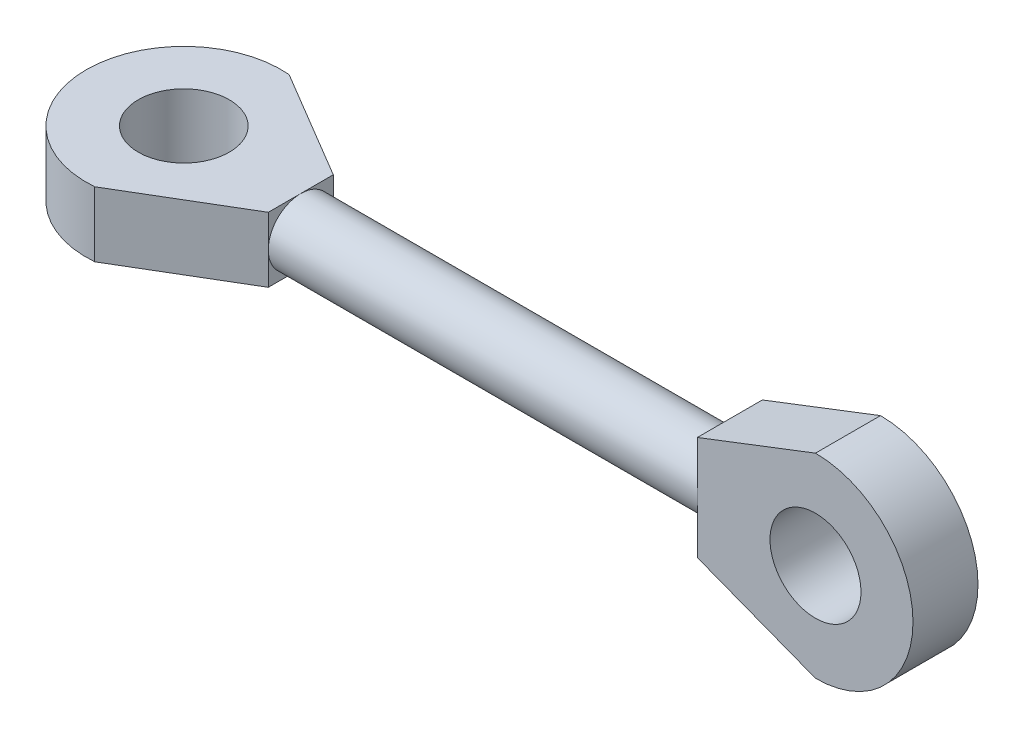
ISO-10303-21;
HEADER;
FILE_DESCRIPTION(('STEP AP214'),'2;1');
FILE_NAME('part.step','',(''),(''),'','','');
FILE_SCHEMA(('AUTOMOTIVE_DESIGN { 1 0 10303 214 1 1 1 1 }'));
ENDSEC;
DATA;
#1=APPLICATION_CONTEXT('core data for automotive mechanical design processes');
#2=APPLICATION_PROTOCOL_DEFINITION('international standard','automotive_design',2000,#1);
#3=PRODUCT_CONTEXT('',#1,'mechanical');
#4=PRODUCT('Part','Part','',(#3));
#5=PRODUCT_RELATED_PRODUCT_CATEGORY('part','',(#4));
#6=PRODUCT_DEFINITION_FORMATION('','',#4);
#7=PRODUCT_DEFINITION_CONTEXT('part definition',#1,'design');
#8=PRODUCT_DEFINITION('design','',#6,#7);
#9=PRODUCT_DEFINITION_SHAPE('','',#8);
#10=(LENGTH_UNIT() NAMED_UNIT(*) SI_UNIT(.MILLI.,.METRE.));
#11=(NAMED_UNIT(*) PLANE_ANGLE_UNIT() SI_UNIT($,.RADIAN.));
#12=(NAMED_UNIT(*) SI_UNIT($,.STERADIAN.) SOLID_ANGLE_UNIT());
#13=UNCERTAINTY_MEASURE_WITH_UNIT(LENGTH_MEASURE(1.E-05),#10,'distance_accuracy_value','');
#14=(GEOMETRIC_REPRESENTATION_CONTEXT(3) GLOBAL_UNCERTAINTY_ASSIGNED_CONTEXT((#13)) GLOBAL_UNIT_ASSIGNED_CONTEXT((#10,
#11,#12)) REPRESENTATION_CONTEXT('',''));
#15=CARTESIAN_POINT('',(0.,0.,0.));
#16=DIRECTION('',(0.,0.,1.));
#17=DIRECTION('',(1.,0.,0.));
#18=AXIS2_PLACEMENT_3D('',#15,#16,#17);
#19=CARTESIAN_POINT('',(-9.08842369138796,0.,2.5));
#20=DIRECTION('',(1.,0.,0.));
#21=DIRECTION('',(0.,0.,-1.));
#22=AXIS2_PLACEMENT_3D('',#19,#20,#21);
#23=PLANE('',#22);
#24=CARTESIAN_POINT('',(-9.08842369138796,0.,0.));
#25=DIRECTION('',(-1.,0.,0.));
#26=DIRECTION('',(0.,0.,1.));
#27=AXIS2_PLACEMENT_3D('',#24,#25,#26);
#28=CIRCLE('',#27,2.5);
#29=CARTESIAN_POINT('',(-9.08842369138796,0.,2.5));
#30=VERTEX_POINT('',#29);
#31=CARTESIAN_POINT('',(-9.08842369138796,0.,-2.5));
#32=VERTEX_POINT('',#31);
#33=EDGE_CURVE('E52',#30,#32,#28,.T.);
#34=ORIENTED_EDGE('',*,*,#33,.F.);
#35=DIRECTION('',(0.,-1.,0.));
#36=VECTOR('',#35,1.);
#37=CARTESIAN_POINT('',(-9.08842369138796,0.,2.5));
#38=LINE('',#37,#36);
#39=CARTESIAN_POINT('',(-9.08842369138796,4.,2.5));
#40=VERTEX_POINT('',#39);
#41=EDGE_CURVE('E187',#40,#30,#38,.T.);
#42=ORIENTED_EDGE('',*,*,#41,.F.);
#43=DIRECTION('',(0.,0.,-1.));
#44=VECTOR('',#43,1.);
#45=CARTESIAN_POINT('',(-9.08842369138796,4.,2.5));
#46=LINE('',#45,#44);
#47=CARTESIAN_POINT('',(-9.08842369138796,4.,-2.5));
#48=VERTEX_POINT('',#47);
#49=EDGE_CURVE('E213',#40,#48,#46,.T.);
#50=ORIENTED_EDGE('',*,*,#49,.T.);
#51=DIRECTION('',(0.,-1.,0.));
#52=VECTOR('',#51,1.);
#53=CARTESIAN_POINT('',(-9.08842369138796,0.,-2.5));
#54=LINE('',#53,#52);
#55=EDGE_CURVE('E174',#48,#32,#54,.T.);
#56=ORIENTED_EDGE('',*,*,#55,.T.);
#57=EDGE_LOOP('',(#34,#42,#50,#56));
#58=FACE_BOUND('',#57,.T.);
#59=ADVANCED_FACE('F41',(#58),#23,.F.);
#60=CARTESIAN_POINT('',(-2.51526112156498,-6.53135964778805,2.5));
#61=DIRECTION('',(-0.359377304460914,-0.933192345145634,0.));
#62=DIRECTION('',(0.933192345145634,-0.359377304460914,0.));
#63=AXIS2_PLACEMENT_3D('',#60,#61,#62);
#64=PLANE('',#63);
#65=DIRECTION('',(-0.933192345145634,0.359377304460914,0.));
#66=VECTOR('',#65,1.);
#67=CARTESIAN_POINT('',(-2.51526112156498,-6.53135964778805,-2.5));
#68=LINE('',#67,#66);
#69=CARTESIAN_POINT('',(0.,-7.5,-2.5));
#70=VERTEX_POINT('',#69);
#71=CARTESIAN_POINT('',(-9.08842369138796,-4.,-2.5));
#72=VERTEX_POINT('',#71);
#73=EDGE_CURVE('E194',#70,#72,#68,.T.);
#74=ORIENTED_EDGE('',*,*,#73,.F.);
#75=DIRECTION('',(0.,0.,-1.));
#76=VECTOR('',#75,1.);
#77=CARTESIAN_POINT('',(0.,-7.5,2.5));
#78=LINE('',#77,#76);
#79=CARTESIAN_POINT('',(0.,-7.5,2.5));
#80=VERTEX_POINT('',#79);
#81=EDGE_CURVE('E45',#80,#70,#78,.T.);
#82=ORIENTED_EDGE('',*,*,#81,.F.);
#83=DIRECTION('',(-0.933192345145634,0.359377304460914,0.));
#84=VECTOR('',#83,1.);
#85=CARTESIAN_POINT('',(-2.51526112156498,-6.53135964778805,2.5));
#86=LINE('',#85,#84);
#87=CARTESIAN_POINT('',(-9.08842369138796,-4.,2.5));
#88=VERTEX_POINT('',#87);
#89=EDGE_CURVE('E173',#80,#88,#86,.T.);
#90=ORIENTED_EDGE('',*,*,#89,.T.);
#91=DIRECTION('',(0.,0.,-1.));
#92=VECTOR('',#91,1.);
#93=CARTESIAN_POINT('',(-9.08842369138796,-4.,2.5));
#94=LINE('',#93,#92);
#95=EDGE_CURVE('E190',#88,#72,#94,.T.);
#96=ORIENTED_EDGE('',*,*,#95,.T.);
#97=EDGE_LOOP('',(#74,#82,#90,#96));
#98=FACE_BOUND('',#97,.T.);
#99=ADVANCED_FACE('F232',(#98),#64,.T.);
#100=CARTESIAN_POINT('',(0.,0.,2.5));
#101=DIRECTION('',(0.,0.,-1.));
#102=DIRECTION('',(-1.,0.,0.));
#103=AXIS2_PLACEMENT_3D('',#100,#101,#102);
#104=CYLINDRICAL_SURFACE('',#103,7.5);
#105=CARTESIAN_POINT('',(0.,0.,-2.5));
#106=DIRECTION('',(0.,0.,1.));
#107=DIRECTION('',(1.,0.,0.));
#108=AXIS2_PLACEMENT_3D('',#105,#106,#107);
#109=CIRCLE('',#108,7.5);
#110=CARTESIAN_POINT('',(0.,7.5,-2.5));
#111=VERTEX_POINT('',#110);
#112=EDGE_CURVE('E198',#70,#111,#109,.T.);
#113=ORIENTED_EDGE('',*,*,#112,.T.);
#114=DIRECTION('',(0.,0.,-1.));
#115=VECTOR('',#114,1.);
#116=CARTESIAN_POINT('',(0.,7.5,2.5));
#117=LINE('',#116,#115);
#118=CARTESIAN_POINT('',(0.,7.5,2.5));
#119=VERTEX_POINT('',#118);
#120=EDGE_CURVE('E216',#119,#111,#117,.T.);
#121=ORIENTED_EDGE('',*,*,#120,.F.);
#122=CARTESIAN_POINT('',(0.,0.,2.5));
#123=DIRECTION('',(0.,0.,1.));
#124=DIRECTION('',(1.,0.,0.));
#125=AXIS2_PLACEMENT_3D('',#122,#123,#124);
#126=CIRCLE('',#125,7.5);
#127=EDGE_CURVE('E178',#80,#119,#126,.T.);
#128=ORIENTED_EDGE('',*,*,#127,.F.);
#129=ORIENTED_EDGE('',*,*,#81,.T.);
#130=EDGE_LOOP('',(#113,#121,#128,#129));
#131=FACE_BOUND('',#130,.T.);
#132=ADVANCED_FACE('F225',(#131),#104,.T.);
#133=CARTESIAN_POINT('',(-2.51526112156498,6.53135964778805,2.5));
#134=DIRECTION('',(0.359377304460914,-0.933192345145634,0.));
#135=DIRECTION('',(0.933192345145634,0.359377304460914,0.));
#136=AXIS2_PLACEMENT_3D('',#133,#134,#135);
#137=PLANE('',#136);
#138=DIRECTION('',(-0.933192345145634,-0.359377304460914,0.));
#139=VECTOR('',#138,1.);
#140=CARTESIAN_POINT('',(-2.51526112156498,6.53135964778805,-2.5));
#141=LINE('',#140,#139);
#142=EDGE_CURVE('E202',#111,#48,#141,.T.);
#143=ORIENTED_EDGE('',*,*,#142,.T.);
#144=ORIENTED_EDGE('',*,*,#49,.F.);
#145=DIRECTION('',(-0.933192345145634,-0.359377304460914,0.));
#146=VECTOR('',#145,1.);
#147=CARTESIAN_POINT('',(-2.51526112156498,6.53135964778805,2.5));
#148=LINE('',#147,#146);
#149=EDGE_CURVE('E182',#119,#40,#148,.T.);
#150=ORIENTED_EDGE('',*,*,#149,.F.);
#151=ORIENTED_EDGE('',*,*,#120,.T.);
#152=EDGE_LOOP('',(#143,#144,#150,#151));
#153=FACE_BOUND('',#152,.T.);
#154=ADVANCED_FACE('F319',(#153),#137,.F.);
#155=CARTESIAN_POINT('',(0.,0.,2.5));
#156=DIRECTION('',(0.,0.,-1.));
#157=DIRECTION('',(-1.,0.,0.));
#158=AXIS2_PLACEMENT_3D('',#155,#156,#157);
#159=CYLINDRICAL_SURFACE('',#158,3.5);
#160=CARTESIAN_POINT('',(0.,0.,2.5));
#161=DIRECTION('',(0.,0.,1.));
#162=DIRECTION('',(1.,0.,0.));
#163=AXIS2_PLACEMENT_3D('',#160,#161,#162);
#164=CIRCLE('',#163,3.5);
#165=CARTESIAN_POINT('',(3.5,0.,2.5));
#166=VERTEX_POINT('',#165);
#167=EDGE_CURVE('E169',#166,#166,#164,.T.);
#168=ORIENTED_EDGE('',*,*,#167,.T.);
#169=EDGE_LOOP('',(#168));
#170=FACE_BOUND('',#169,.T.);
#171=CARTESIAN_POINT('',(0.,0.,-2.5));
#172=DIRECTION('',(0.,0.,1.));
#173=DIRECTION('',(1.,0.,0.));
#174=AXIS2_PLACEMENT_3D('',#171,#172,#173);
#175=CIRCLE('',#174,3.5);
#176=CARTESIAN_POINT('',(3.5,0.,-2.5));
#177=VERTEX_POINT('',#176);
#178=EDGE_CURVE('E166',#177,#177,#175,.T.);
#179=ORIENTED_EDGE('',*,*,#178,.F.);
#180=EDGE_LOOP('',(#179));
#181=FACE_BOUND('',#180,.T.);
#182=ADVANCED_FACE('F43',(#170,#181),#159,.F.);
#183=EDGE_CURVE('E11',#32,#30,#28,.T.);
#184=ORIENTED_EDGE('',*,*,#183,.F.);
#185=EDGE_CURVE('E206',#32,#72,#54,.T.);
#186=ORIENTED_EDGE('',*,*,#185,.T.);
#187=ORIENTED_EDGE('',*,*,#95,.F.);
#188=EDGE_CURVE('E186',#30,#88,#38,.T.);
#189=ORIENTED_EDGE('',*,*,#188,.F.);
#190=EDGE_LOOP('',(#184,#186,#187,#189));
#191=FACE_BOUND('',#190,.T.);
#192=ADVANCED_FACE('F236',(#191),#23,.F.);
#193=CARTESIAN_POINT('',(0.,0.,2.5));
#194=DIRECTION('',(0.,0.,1.));
#195=DIRECTION('',(1.,0.,0.));
#196=AXIS2_PLACEMENT_3D('',#193,#194,#195);
#197=PLANE('',#196);
#198=ORIENTED_EDGE('',*,*,#167,.F.);
#199=EDGE_LOOP('',(#198));
#200=FACE_BOUND('',#199,.T.);
#201=ORIENTED_EDGE('',*,*,#89,.F.);
#202=ORIENTED_EDGE('',*,*,#127,.T.);
#203=ORIENTED_EDGE('',*,*,#149,.T.);
#204=ORIENTED_EDGE('',*,*,#41,.T.);
#205=ORIENTED_EDGE('',*,*,#188,.T.);
#206=EDGE_LOOP('',(#201,#202,#203,#204,#205));
#207=FACE_BOUND('',#206,.T.);
#208=ADVANCED_FACE('F312',(#200,#207),#197,.T.);
#209=CARTESIAN_POINT('',(0.,0.,-2.5));
#210=DIRECTION('',(0.,0.,1.));
#211=DIRECTION('',(1.,0.,0.));
#212=AXIS2_PLACEMENT_3D('',#209,#210,#211);
#213=PLANE('',#212);
#214=ORIENTED_EDGE('',*,*,#178,.T.);
#215=EDGE_LOOP('',(#214));
#216=FACE_BOUND('',#215,.T.);
#217=ORIENTED_EDGE('',*,*,#73,.T.);
#218=ORIENTED_EDGE('',*,*,#185,.F.);
#219=ORIENTED_EDGE('',*,*,#55,.F.);
#220=ORIENTED_EDGE('',*,*,#142,.F.);
#221=ORIENTED_EDGE('',*,*,#112,.F.);
#222=EDGE_LOOP('',(#217,#218,#219,#220,#221));
#223=FACE_BOUND('',#222,.T.);
#224=ADVANCED_FACE('F230',(#216,#223),#213,.F.);
#225=CARTESIAN_POINT('',(-42.088423691388,0.,0.));
#226=DIRECTION('',(1.,0.,0.));
#227=DIRECTION('',(0.,0.,-1.));
#228=AXIS2_PLACEMENT_3D('',#225,#226,#227);
#229=CYLINDRICAL_SURFACE('',#228,2.5);
#230=CARTESIAN_POINT('',(-42.088423691388,0.,0.));
#231=DIRECTION('',(-1.,0.,0.));
#232=DIRECTION('',(0.,0.,1.));
#233=AXIS2_PLACEMENT_3D('',#230,#231,#232);
#234=CIRCLE('',#233,2.5);
#235=CARTESIAN_POINT('',(-42.088423691388,0.,2.5));
#236=VERTEX_POINT('',#235);
#237=CARTESIAN_POINT('',(-42.088423691388,2.5,0.));
#238=VERTEX_POINT('',#237);
#239=EDGE_CURVE('E163',#236,#238,#234,.T.);
#240=ORIENTED_EDGE('',*,*,#239,.F.);
#241=CARTESIAN_POINT('',(-42.088423691388,-2.5,0.));
#242=VERTEX_POINT('',#241);
#243=EDGE_CURVE('E59',#242,#236,#234,.T.);
#244=ORIENTED_EDGE('',*,*,#243,.F.);
#245=CARTESIAN_POINT('',(-42.088423691388,0.,-2.5));
#246=VERTEX_POINT('',#245);
#247=EDGE_CURVE('E63',#246,#242,#234,.T.);
#248=ORIENTED_EDGE('',*,*,#247,.F.);
#249=EDGE_CURVE('E167',#238,#246,#234,.T.);
#250=ORIENTED_EDGE('',*,*,#249,.F.);
#251=EDGE_LOOP('',(#240,#244,#248,#250));
#252=FACE_BOUND('',#251,.T.);
#253=ORIENTED_EDGE('',*,*,#33,.T.);
#254=ORIENTED_EDGE('',*,*,#183,.T.);
#255=EDGE_LOOP('',(#253,#254));
#256=FACE_BOUND('',#255,.T.);
#257=ADVANCED_FACE('F329',(#252,#256),#229,.T.);
#258=CARTESIAN_POINT('',(-42.088423691388,2.5,-2.5));
#259=DIRECTION('',(-1.,0.,0.));
#260=DIRECTION('',(0.,0.,1.));
#261=AXIS2_PLACEMENT_3D('',#258,#259,#260);
#262=PLANE('',#261);
#263=DIRECTION('',(0.,-1.,0.));
#264=VECTOR('',#263,1.);
#265=CARTESIAN_POINT('',(-42.088423691388,2.5,2.5));
#266=LINE('',#265,#264);
#267=CARTESIAN_POINT('',(-42.088423691388,2.5,2.5));
#268=VERTEX_POINT('',#267);
#269=EDGE_CURVE('E159',#268,#236,#266,.T.);
#270=ORIENTED_EDGE('',*,*,#269,.T.);
#271=ORIENTED_EDGE('',*,*,#239,.T.);
#272=DIRECTION('',(0.,0.,-1.));
#273=VECTOR('',#272,1.);
#274=CARTESIAN_POINT('',(-42.088423691388,2.5,-2.5));
#275=LINE('',#274,#273);
#276=EDGE_CURVE('E260',#268,#238,#275,.T.);
#277=ORIENTED_EDGE('',*,*,#276,.F.);
#278=EDGE_LOOP('',(#270,#271,#277));
#279=FACE_BOUND('',#278,.T.);
#280=ADVANCED_FACE('F259',(#279),#262,.F.);
#281=CARTESIAN_POINT('',(-42.088423691388,2.5,-2.5));
#282=VERTEX_POINT('',#281);
#283=EDGE_CURVE('E144',#238,#282,#275,.T.);
#284=ORIENTED_EDGE('',*,*,#283,.F.);
#285=ORIENTED_EDGE('',*,*,#249,.T.);
#286=DIRECTION('',(0.,-1.,0.));
#287=VECTOR('',#286,1.);
#288=CARTESIAN_POINT('',(-42.088423691388,2.5,-2.5));
#289=LINE('',#288,#287);
#290=EDGE_CURVE('E257',#282,#246,#289,.T.);
#291=ORIENTED_EDGE('',*,*,#290,.F.);
#292=EDGE_LOOP('',(#284,#285,#291));
#293=FACE_BOUND('',#292,.T.);
#294=ADVANCED_FACE('F341',(#293),#262,.F.);
#295=CARTESIAN_POINT('',(-42.088423691388,-2.5,-2.5));
#296=VERTEX_POINT('',#295);
#297=EDGE_CURVE('E265',#246,#296,#289,.T.);
#298=ORIENTED_EDGE('',*,*,#297,.F.);
#299=ORIENTED_EDGE('',*,*,#247,.T.);
#300=DIRECTION('',(0.,0.,-1.));
#301=VECTOR('',#300,1.);
#302=CARTESIAN_POINT('',(-42.088423691388,-2.5,-2.5));
#303=LINE('',#302,#301);
#304=EDGE_CURVE('E268',#242,#296,#303,.T.);
#305=ORIENTED_EDGE('',*,*,#304,.T.);
#306=EDGE_LOOP('',(#298,#299,#305));
#307=FACE_BOUND('',#306,.T.);
#308=ADVANCED_FACE('F300',(#307),#262,.F.);
#309=CARTESIAN_POINT('',(-42.088423691388,-2.5,2.5));
#310=VERTEX_POINT('',#309);
#311=EDGE_CURVE('E149',#310,#242,#303,.T.);
#312=ORIENTED_EDGE('',*,*,#311,.T.);
#313=ORIENTED_EDGE('',*,*,#243,.T.);
#314=EDGE_CURVE('E246',#236,#310,#266,.T.);
#315=ORIENTED_EDGE('',*,*,#314,.T.);
#316=EDGE_LOOP('',(#312,#313,#315));
#317=FACE_BOUND('',#316,.T.);
#318=ADVANCED_FACE('F245',(#317),#262,.F.);
#319=CARTESIAN_POINT('',(-51.088423691388,2.5,0.));
#320=DIRECTION('',(0.,1.,0.));
#321=DIRECTION('',(0.,0.,1.));
#322=AXIS2_PLACEMENT_3D('',#319,#320,#321);
#323=PLANE('',#322);
#324=DIRECTION('',(-0.85978131074842,0.,-0.51066241068609));
#325=VECTOR('',#324,1.);
#326=CARTESIAN_POINT('',(-42.088423691388,2.5,-2.5));
#327=LINE('',#326,#325);
#328=CARTESIAN_POINT('',(-50.4626936580776,2.5,-7.47385188008253));
#329=VERTEX_POINT('',#328);
#330=EDGE_CURVE('E137',#282,#329,#327,.T.);
#331=ORIENTED_EDGE('',*,*,#330,.T.);
#332=CARTESIAN_POINT('',(-51.088423691388,2.5,0.));
#333=DIRECTION('',(0.,1.,0.));
#334=DIRECTION('',(0.,0.,1.));
#335=AXIS2_PLACEMENT_3D('',#332,#333,#334);
#336=CIRCLE('',#335,7.49999999999999);
#337=CARTESIAN_POINT('',(-50.4626936580776,2.5,7.47385188008254));
#338=VERTEX_POINT('',#337);
#339=EDGE_CURVE('E125',#329,#338,#336,.T.);
#340=ORIENTED_EDGE('',*,*,#339,.T.);
#341=DIRECTION('',(0.859781310748419,0.,-0.510662410686092));
#342=VECTOR('',#341,1.);
#343=CARTESIAN_POINT('',(-42.088423691388,2.5,2.5));
#344=LINE('',#343,#342);
#345=EDGE_CURVE('E136',#338,#268,#344,.T.);
#346=ORIENTED_EDGE('',*,*,#345,.T.);
#347=ORIENTED_EDGE('',*,*,#276,.T.);
#348=ORIENTED_EDGE('',*,*,#283,.T.);
#349=EDGE_LOOP('',(#331,#340,#346,#347,#348));
#350=FACE_BOUND('',#349,.T.);
#351=CARTESIAN_POINT('',(-51.088423691388,2.5,0.));
#352=DIRECTION('',(0.,1.,0.));
#353=DIRECTION('',(0.,0.,1.));
#354=AXIS2_PLACEMENT_3D('',#351,#352,#353);
#355=CIRCLE('',#354,3.5);
#356=CARTESIAN_POINT('',(-51.088423691388,2.5,3.5));
#357=VERTEX_POINT('',#356);
#358=EDGE_CURVE('E276',#357,#357,#355,.T.);
#359=ORIENTED_EDGE('',*,*,#358,.F.);
#360=EDGE_LOOP('',(#359));
#361=FACE_BOUND('',#360,.T.);
#362=ADVANCED_FACE('F140',(#350,#361),#323,.T.);
#363=CARTESIAN_POINT('',(-51.088423691388,-2.5,0.));
#364=DIRECTION('',(0.,1.,0.));
#365=DIRECTION('',(0.,0.,1.));
#366=AXIS2_PLACEMENT_3D('',#363,#364,#365);
#367=PLANE('',#366);
#368=DIRECTION('',(-0.85978131074842,0.,-0.51066241068609));
#369=VECTOR('',#368,1.);
#370=CARTESIAN_POINT('',(-42.088423691388,-2.5,-2.5));
#371=LINE('',#370,#369);
#372=CARTESIAN_POINT('',(-50.4626936580776,-2.5,-7.47385188008253));
#373=VERTEX_POINT('',#372);
#374=EDGE_CURVE('E153',#296,#373,#371,.T.);
#375=ORIENTED_EDGE('',*,*,#374,.F.);
#376=ORIENTED_EDGE('',*,*,#304,.F.);
#377=ORIENTED_EDGE('',*,*,#311,.F.);
#378=DIRECTION('',(0.859781310748419,0.,-0.510662410686092));
#379=VECTOR('',#378,1.);
#380=CARTESIAN_POINT('',(-42.088423691388,-2.5,2.5));
#381=LINE('',#380,#379);
#382=CARTESIAN_POINT('',(-50.4626936580776,-2.5,7.47385188008254));
#383=VERTEX_POINT('',#382);
#384=EDGE_CURVE('E255',#383,#310,#381,.T.);
#385=ORIENTED_EDGE('',*,*,#384,.F.);
#386=CARTESIAN_POINT('',(-51.088423691388,-2.5,0.));
#387=DIRECTION('',(0.,1.,0.));
#388=DIRECTION('',(0.,0.,1.));
#389=AXIS2_PLACEMENT_3D('',#386,#387,#388);
#390=CIRCLE('',#389,7.49999999999999);
#391=EDGE_CURVE('E271',#373,#383,#390,.T.);
#392=ORIENTED_EDGE('',*,*,#391,.F.);
#393=EDGE_LOOP('',(#375,#376,#377,#385,#392));
#394=FACE_BOUND('',#393,.T.);
#395=CARTESIAN_POINT('',(-51.088423691388,-2.5,0.));
#396=DIRECTION('',(0.,1.,0.));
#397=DIRECTION('',(0.,0.,1.));
#398=AXIS2_PLACEMENT_3D('',#395,#396,#397);
#399=CIRCLE('',#398,3.5);
#400=CARTESIAN_POINT('',(-51.088423691388,-2.5,3.5));
#401=VERTEX_POINT('',#400);
#402=EDGE_CURVE('E281',#401,#401,#399,.T.);
#403=ORIENTED_EDGE('',*,*,#402,.T.);
#404=EDGE_LOOP('',(#403));
#405=FACE_BOUND('',#404,.T.);
#406=ADVANCED_FACE('F292',(#394,#405),#367,.F.);
#407=CARTESIAN_POINT('',(-42.088423691388,2.5,-2.5));
#408=DIRECTION('',(-0.51066241068609,0.,0.85978131074842));
#409=DIRECTION('',(0.85978131074842,0.,0.51066241068609));
#410=AXIS2_PLACEMENT_3D('',#407,#408,#409);
#411=PLANE('',#410);
#412=ORIENTED_EDGE('',*,*,#374,.T.);
#413=DIRECTION('',(0.,-1.,0.));
#414=VECTOR('',#413,1.);
#415=CARTESIAN_POINT('',(-50.4626936580776,2.5,-7.47385188008253));
#416=LINE('',#415,#414);
#417=EDGE_CURVE('E129',#329,#373,#416,.T.);
#418=ORIENTED_EDGE('',*,*,#417,.F.);
#419=ORIENTED_EDGE('',*,*,#330,.F.);
#420=ORIENTED_EDGE('',*,*,#290,.T.);
#421=ORIENTED_EDGE('',*,*,#297,.T.);
#422=EDGE_LOOP('',(#412,#418,#419,#420,#421));
#423=FACE_BOUND('',#422,.T.);
#424=ADVANCED_FACE('F151',(#423),#411,.F.);
#425=CARTESIAN_POINT('',(-51.088423691388,2.5,0.));
#426=DIRECTION('',(0.,-1.,0.));
#427=DIRECTION('',(0.,0.,-1.));
#428=AXIS2_PLACEMENT_3D('',#425,#426,#427);
#429=CYLINDRICAL_SURFACE('',#428,7.49999999999999);
#430=ORIENTED_EDGE('',*,*,#391,.T.);
#431=DIRECTION('',(0.,-1.,0.));
#432=VECTOR('',#431,1.);
#433=CARTESIAN_POINT('',(-50.4626936580776,2.5,7.47385188008254));
#434=LINE('',#433,#432);
#435=EDGE_CURVE('E132',#338,#383,#434,.T.);
#436=ORIENTED_EDGE('',*,*,#435,.F.);
#437=ORIENTED_EDGE('',*,*,#339,.F.);
#438=ORIENTED_EDGE('',*,*,#417,.T.);
#439=EDGE_LOOP('',(#430,#436,#437,#438));
#440=FACE_BOUND('',#439,.T.);
#441=ADVANCED_FACE('F127',(#440),#429,.T.);
#442=CARTESIAN_POINT('',(-42.088423691388,2.5,2.5));
#443=DIRECTION('',(-0.510662410686092,0.,-0.859781310748419));
#444=DIRECTION('',(-0.859781310748419,0.,0.510662410686092));
#445=AXIS2_PLACEMENT_3D('',#442,#443,#444);
#446=PLANE('',#445);
#447=ORIENTED_EDGE('',*,*,#384,.T.);
#448=ORIENTED_EDGE('',*,*,#314,.F.);
#449=ORIENTED_EDGE('',*,*,#269,.F.);
#450=ORIENTED_EDGE('',*,*,#345,.F.);
#451=ORIENTED_EDGE('',*,*,#435,.T.);
#452=EDGE_LOOP('',(#447,#448,#449,#450,#451));
#453=FACE_BOUND('',#452,.T.);
#454=ADVANCED_FACE('F252',(#453),#446,.F.);
#455=CARTESIAN_POINT('',(-51.088423691388,2.5,0.));
#456=DIRECTION('',(0.,-1.,0.));
#457=DIRECTION('',(0.,0.,-1.));
#458=AXIS2_PLACEMENT_3D('',#455,#456,#457);
#459=CYLINDRICAL_SURFACE('',#458,3.5);
#460=ORIENTED_EDGE('',*,*,#358,.T.);
#461=EDGE_LOOP('',(#460));
#462=FACE_BOUND('',#461,.T.);
#463=ORIENTED_EDGE('',*,*,#402,.F.);
#464=EDGE_LOOP('',(#463));
#465=FACE_BOUND('',#464,.T.);
#466=ADVANCED_FACE('F289',(#462,#465),#459,.F.);
#467=CLOSED_SHELL('',(#59,#99,#132,#154,#182,#192,#208,#224,#257,#280,#294,#308,#318,#362,#406,
#424,#441,#454,#466));
#468=MANIFOLD_SOLID_BREP('B2',#467);
#469=ADVANCED_BREP_SHAPE_REPRESENTATION('',(#18,#468),#14);
#470=SHAPE_DEFINITION_REPRESENTATION(#9,#469);
ENDSEC;
END-ISO-10303-21;
